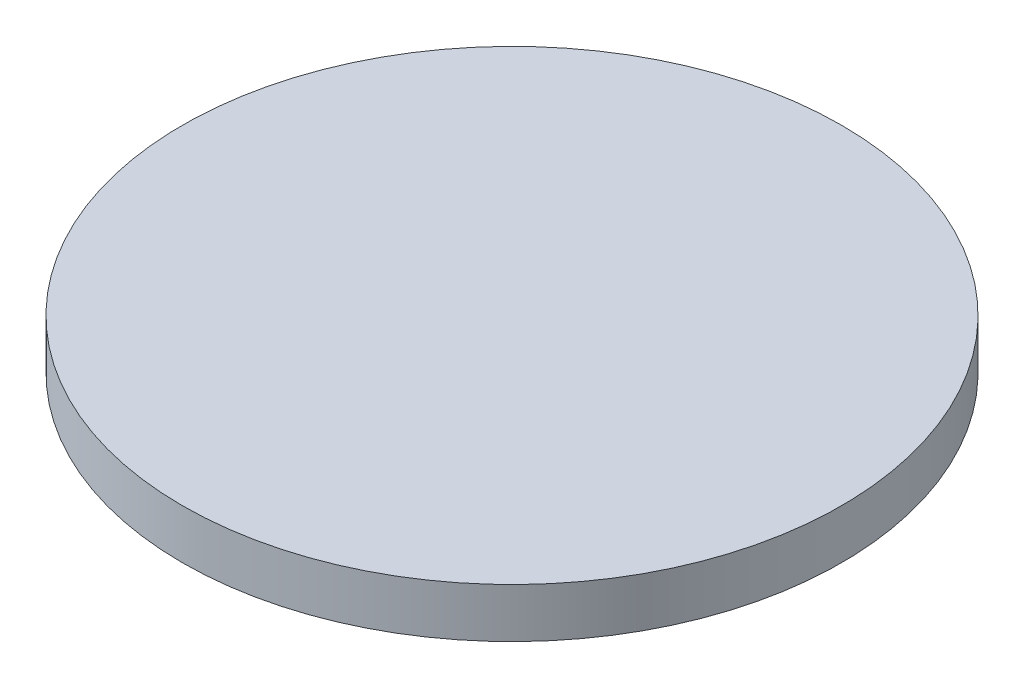
ISO-10303-21;
HEADER;
FILE_DESCRIPTION(('STEP AP214'),'2;1');
FILE_NAME('part.step','',(''),(''),'','','');
FILE_SCHEMA(('AUTOMOTIVE_DESIGN { 1 0 10303 214 1 1 1 1 }'));
ENDSEC;
DATA;
#1=APPLICATION_CONTEXT('core data for automotive mechanical design processes');
#2=APPLICATION_PROTOCOL_DEFINITION('international standard','automotive_design',2000,#1);
#3=PRODUCT_CONTEXT('',#1,'mechanical');
#4=PRODUCT('Part','Part','',(#3));
#5=PRODUCT_RELATED_PRODUCT_CATEGORY('part','',(#4));
#6=PRODUCT_DEFINITION_FORMATION('','',#4);
#7=PRODUCT_DEFINITION_CONTEXT('part definition',#1,'design');
#8=PRODUCT_DEFINITION('design','',#6,#7);
#9=PRODUCT_DEFINITION_SHAPE('','',#8);
#10=(LENGTH_UNIT() NAMED_UNIT(*) SI_UNIT(.MILLI.,.METRE.));
#11=(NAMED_UNIT(*) PLANE_ANGLE_UNIT() SI_UNIT($,.RADIAN.));
#12=(NAMED_UNIT(*) SI_UNIT($,.STERADIAN.) SOLID_ANGLE_UNIT());
#13=UNCERTAINTY_MEASURE_WITH_UNIT(LENGTH_MEASURE(1.E-05),#10,'distance_accuracy_value','');
#14=(GEOMETRIC_REPRESENTATION_CONTEXT(3) GLOBAL_UNCERTAINTY_ASSIGNED_CONTEXT((#13)) GLOBAL_UNIT_ASSIGNED_CONTEXT((#10,
#11,#12)) REPRESENTATION_CONTEXT('',''));
#15=CARTESIAN_POINT('',(0.,0.,0.));
#16=DIRECTION('',(0.,0.,1.));
#17=DIRECTION('',(1.,0.,0.));
#18=AXIS2_PLACEMENT_3D('',#15,#16,#17);
#19=CARTESIAN_POINT('',(0.,3.,0.));
#20=DIRECTION('',(0.,-1.,0.));
#21=DIRECTION('',(0.,0.,-1.));
#22=AXIS2_PLACEMENT_3D('',#19,#20,#21);
#23=CYLINDRICAL_SURFACE('',#22,20.);
#24=CARTESIAN_POINT('',(0.,3.,0.));
#25=DIRECTION('',(0.,1.,0.));
#26=DIRECTION('',(0.,0.,1.));
#27=AXIS2_PLACEMENT_3D('',#24,#25,#26);
#28=CIRCLE('',#27,20.);
#29=CARTESIAN_POINT('',(0.,3.,20.));
#30=VERTEX_POINT('',#29);
#31=EDGE_CURVE('E10',#30,#30,#28,.T.);
#32=ORIENTED_EDGE('',*,*,#31,.F.);
#33=EDGE_LOOP('',(#32));
#34=FACE_BOUND('',#33,.T.);
#35=CARTESIAN_POINT('',(0.,0.,0.));
#36=DIRECTION('',(0.,1.,0.));
#37=DIRECTION('',(0.,0.,1.));
#38=AXIS2_PLACEMENT_3D('',#35,#36,#37);
#39=CIRCLE('',#38,20.);
#40=CARTESIAN_POINT('',(0.,0.,20.));
#41=VERTEX_POINT('',#40);
#42=EDGE_CURVE('E40',#41,#41,#39,.T.);
#43=ORIENTED_EDGE('',*,*,#42,.T.);
#44=EDGE_LOOP('',(#43));
#45=FACE_BOUND('',#44,.T.);
#46=ADVANCED_FACE('F37',(#34,#45),#23,.T.);
#47=CARTESIAN_POINT('',(0.,3.,0.));
#48=DIRECTION('',(0.,1.,0.));
#49=DIRECTION('',(0.,0.,1.));
#50=AXIS2_PLACEMENT_3D('',#47,#48,#49);
#51=PLANE('',#50);
#52=ORIENTED_EDGE('',*,*,#31,.T.);
#53=EDGE_LOOP('',(#52));
#54=FACE_BOUND('',#53,.T.);
#55=ADVANCED_FACE('F52',(#54),#51,.T.);
#56=CARTESIAN_POINT('',(0.,0.,0.));
#57=DIRECTION('',(0.,1.,0.));
#58=DIRECTION('',(0.,0.,1.));
#59=AXIS2_PLACEMENT_3D('',#56,#57,#58);
#60=PLANE('',#59);
#61=ORIENTED_EDGE('',*,*,#42,.F.);
#62=EDGE_LOOP('',(#61));
#63=FACE_BOUND('',#62,.T.);
#64=ADVANCED_FACE('F50',(#63),#60,.F.);
#65=CLOSED_SHELL('',(#46,#55,#64));
#66=MANIFOLD_SOLID_BREP('B2',#65);
#67=ADVANCED_BREP_SHAPE_REPRESENTATION('',(#18,#66),#14);
#68=SHAPE_DEFINITION_REPRESENTATION(#9,#67);
ENDSEC;
END-ISO-10303-21;
